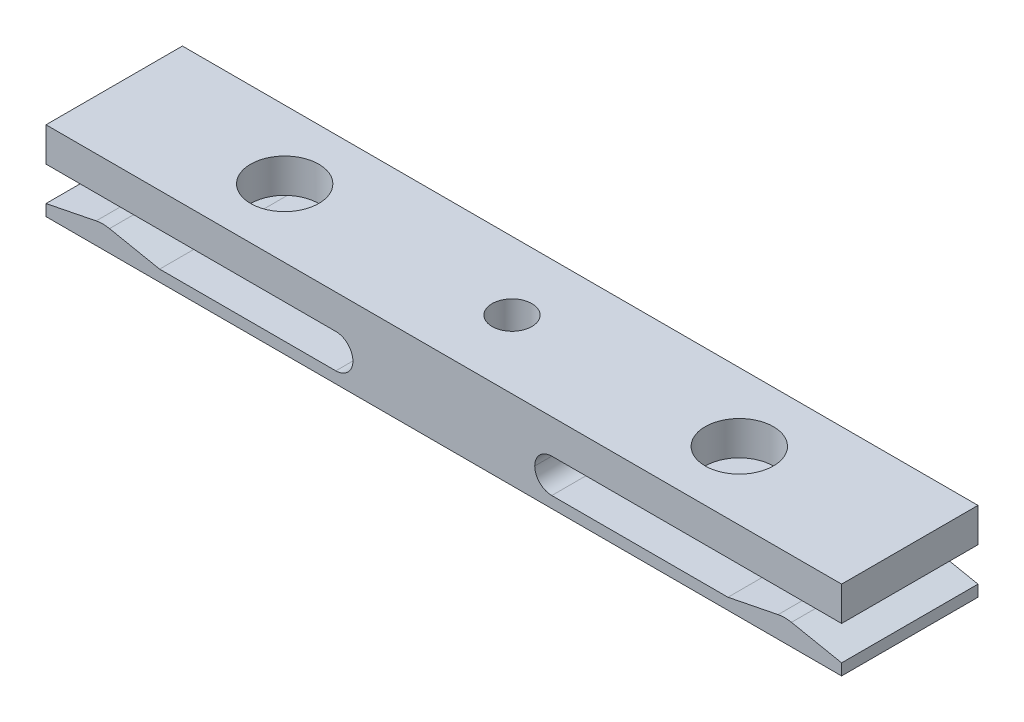
ISO-10303-21;
HEADER;
FILE_DESCRIPTION(('STEP AP214'),'2;1');
FILE_NAME('part.step','',(''),(''),'','','');
FILE_SCHEMA(('AUTOMOTIVE_DESIGN { 1 0 10303 214 1 1 1 1 }'));
ENDSEC;
DATA;
#1=APPLICATION_CONTEXT('core data for automotive mechanical design processes');
#2=APPLICATION_PROTOCOL_DEFINITION('international standard','automotive_design',2000,#1);
#3=PRODUCT_CONTEXT('',#1,'mechanical');
#4=PRODUCT('Part','Part','',(#3));
#5=PRODUCT_RELATED_PRODUCT_CATEGORY('part','',(#4));
#6=PRODUCT_DEFINITION_FORMATION('','',#4);
#7=PRODUCT_DEFINITION_CONTEXT('part definition',#1,'design');
#8=PRODUCT_DEFINITION('design','',#6,#7);
#9=PRODUCT_DEFINITION_SHAPE('','',#8);
#10=(LENGTH_UNIT() NAMED_UNIT(*) SI_UNIT(.MILLI.,.METRE.));
#11=(NAMED_UNIT(*) PLANE_ANGLE_UNIT() SI_UNIT($,.RADIAN.));
#12=(NAMED_UNIT(*) SI_UNIT($,.STERADIAN.) SOLID_ANGLE_UNIT());
#13=UNCERTAINTY_MEASURE_WITH_UNIT(LENGTH_MEASURE(1.E-05),#10,'distance_accuracy_value','');
#14=(GEOMETRIC_REPRESENTATION_CONTEXT(3) GLOBAL_UNCERTAINTY_ASSIGNED_CONTEXT((#13)) GLOBAL_UNIT_ASSIGNED_CONTEXT((#10,
#11,#12)) REPRESENTATION_CONTEXT('',''));
#15=CARTESIAN_POINT('',(0.,0.,0.));
#16=DIRECTION('',(0.,0.,1.));
#17=DIRECTION('',(1.,0.,0.));
#18=AXIS2_PLACEMENT_3D('',#15,#16,#17);
#19=CARTESIAN_POINT('',(0.,0.,6.));
#20=DIRECTION('',(0.,1.,0.));
#21=DIRECTION('',(-1.,0.,0.));
#22=AXIS2_PLACEMENT_3D('',#19,#20,#21);
#23=PLANE('',#22);
#24=CARTESIAN_POINT('',(20.,0.,0.));
#25=DIRECTION('',(0.,-1.,0.));
#26=DIRECTION('',(1.,0.,0.));
#27=AXIS2_PLACEMENT_3D('',#24,#25,#26);
#28=CIRCLE('',#27,4.);
#29=CARTESIAN_POINT('',(24.,0.,0.));
#30=VERTEX_POINT('',#29);
#31=EDGE_CURVE('E242',#30,#30,#28,.F.);
#32=ORIENTED_EDGE('',*,*,#31,.T.);
#33=EDGE_LOOP('',(#32));
#34=FACE_BOUND('',#33,.T.);
#35=CARTESIAN_POINT('',(-20.,0.,0.));
#36=DIRECTION('',(0.,1.,0.));
#37=DIRECTION('',(-1.,0.,0.));
#38=AXIS2_PLACEMENT_3D('',#35,#36,#37);
#39=CIRCLE('',#38,4.);
#40=CARTESIAN_POINT('',(-24.,0.,0.));
#41=VERTEX_POINT('',#40);
#42=EDGE_CURVE('E325',#41,#41,#39,.F.);
#43=ORIENTED_EDGE('',*,*,#42,.F.);
#44=EDGE_LOOP('',(#43));
#45=FACE_BOUND('',#44,.T.);
#46=DIRECTION('',(1.,0.,0.));
#47=VECTOR('',#46,1.);
#48=CARTESIAN_POINT('',(0.,0.,-6.));
#49=LINE('',#48,#47);
#50=CARTESIAN_POINT('',(-35.,0.,-6.));
#51=VERTEX_POINT('',#50);
#52=CARTESIAN_POINT('',(35.,0.,-6.));
#53=VERTEX_POINT('',#52);
#54=EDGE_CURVE('E295',#51,#53,#49,.T.);
#55=ORIENTED_EDGE('',*,*,#54,.T.);
#56=DIRECTION('',(0.,0.,-1.));
#57=VECTOR('',#56,1.);
#58=CARTESIAN_POINT('',(35.,0.,6.));
#59=LINE('',#58,#57);
#60=CARTESIAN_POINT('',(35.,0.,6.));
#61=VERTEX_POINT('',#60);
#62=EDGE_CURVE('E223',#61,#53,#59,.T.);
#63=ORIENTED_EDGE('',*,*,#62,.F.);
#64=DIRECTION('',(1.,0.,0.));
#65=VECTOR('',#64,1.);
#66=CARTESIAN_POINT('',(0.,0.,6.));
#67=LINE('',#66,#65);
#68=CARTESIAN_POINT('',(-35.,0.,6.));
#69=VERTEX_POINT('',#68);
#70=EDGE_CURVE('E296',#69,#61,#67,.T.);
#71=ORIENTED_EDGE('',*,*,#70,.F.);
#72=DIRECTION('',(0.,0.,-1.));
#73=VECTOR('',#72,1.);
#74=CARTESIAN_POINT('',(-35.,0.,6.));
#75=LINE('',#74,#73);
#76=EDGE_CURVE('E307',#69,#51,#75,.T.);
#77=ORIENTED_EDGE('',*,*,#76,.T.);
#78=EDGE_LOOP('',(#55,#63,#71,#77));
#79=FACE_BOUND('',#78,.T.);
#80=CARTESIAN_POINT('',(0.,0.,0.));
#81=DIRECTION('',(0.,1.,0.));
#82=DIRECTION('',(0.,0.,1.));
#83=AXIS2_PLACEMENT_3D('',#80,#81,#82);
#84=CIRCLE('',#83,1.75);
#85=CARTESIAN_POINT('',(0.,0.,1.75));
#86=VERTEX_POINT('',#85);
#87=EDGE_CURVE('E371',#86,#86,#84,.T.);
#88=ORIENTED_EDGE('',*,*,#87,.T.);
#89=EDGE_LOOP('',(#88));
#90=FACE_BOUND('',#89,.T.);
#91=ADVANCED_FACE('F33',(#34,#45,#79,#90),#23,.F.);
#92=CARTESIAN_POINT('',(0.,7.,6.));
#93=DIRECTION('',(0.,-1.,0.));
#94=DIRECTION('',(1.,0.,0.));
#95=AXIS2_PLACEMENT_3D('',#92,#93,#94);
#96=PLANE('',#95);
#97=CARTESIAN_POINT('',(-20.,7.,0.));
#98=DIRECTION('',(0.,1.,0.));
#99=DIRECTION('',(-1.,0.,0.));
#100=AXIS2_PLACEMENT_3D('',#97,#98,#99);
#101=CIRCLE('',#100,3.);
#102=CARTESIAN_POINT('',(-23.,7.,0.));
#103=VERTEX_POINT('',#102);
#104=EDGE_CURVE('E697',#103,#103,#101,.T.);
#105=ORIENTED_EDGE('',*,*,#104,.F.);
#106=EDGE_LOOP('',(#105));
#107=FACE_BOUND('',#106,.T.);
#108=CARTESIAN_POINT('',(20.,7.,0.));
#109=DIRECTION('',(0.,1.,0.));
#110=DIRECTION('',(-1.,0.,0.));
#111=AXIS2_PLACEMENT_3D('',#108,#109,#110);
#112=CIRCLE('',#111,3.);
#113=CARTESIAN_POINT('',(17.,7.,0.));
#114=VERTEX_POINT('',#113);
#115=EDGE_CURVE('E378',#114,#114,#112,.T.);
#116=ORIENTED_EDGE('',*,*,#115,.F.);
#117=EDGE_LOOP('',(#116));
#118=FACE_BOUND('',#117,.T.);
#119=DIRECTION('',(-1.,0.,0.));
#120=VECTOR('',#119,1.);
#121=CARTESIAN_POINT('',(0.,7.,-6.));
#122=LINE('',#121,#120);
#123=CARTESIAN_POINT('',(35.,7.,-6.));
#124=VERTEX_POINT('',#123);
#125=CARTESIAN_POINT('',(-35.,7.,-6.));
#126=VERTEX_POINT('',#125);
#127=EDGE_CURVE('E281',#124,#126,#122,.T.);
#128=ORIENTED_EDGE('',*,*,#127,.T.);
#129=DIRECTION('',(0.,0.,-1.));
#130=VECTOR('',#129,1.);
#131=CARTESIAN_POINT('',(-35.,7.,6.));
#132=LINE('',#131,#130);
#133=CARTESIAN_POINT('',(-35.,7.,6.));
#134=VERTEX_POINT('',#133);
#135=EDGE_CURVE('E178',#134,#126,#132,.T.);
#136=ORIENTED_EDGE('',*,*,#135,.F.);
#137=DIRECTION('',(-1.,0.,0.));
#138=VECTOR('',#137,1.);
#139=CARTESIAN_POINT('',(0.,7.,6.));
#140=LINE('',#139,#138);
#141=CARTESIAN_POINT('',(35.,7.,6.));
#142=VERTEX_POINT('',#141);
#143=EDGE_CURVE('E171',#142,#134,#140,.T.);
#144=ORIENTED_EDGE('',*,*,#143,.F.);
#145=DIRECTION('',(0.,0.,-1.));
#146=VECTOR('',#145,1.);
#147=CARTESIAN_POINT('',(35.,7.,6.));
#148=LINE('',#147,#146);
#149=EDGE_CURVE('E175',#142,#124,#148,.T.);
#150=ORIENTED_EDGE('',*,*,#149,.T.);
#151=EDGE_LOOP('',(#128,#136,#144,#150));
#152=FACE_BOUND('',#151,.T.);
#153=CARTESIAN_POINT('',(0.,7.,0.));
#154=DIRECTION('',(0.,1.,0.));
#155=DIRECTION('',(0.,0.,1.));
#156=AXIS2_PLACEMENT_3D('',#153,#154,#155);
#157=CIRCLE('',#156,1.75);
#158=CARTESIAN_POINT('',(0.,7.,1.75));
#159=VERTEX_POINT('',#158);
#160=EDGE_CURVE('E275',#159,#159,#157,.T.);
#161=ORIENTED_EDGE('',*,*,#160,.F.);
#162=EDGE_LOOP('',(#161));
#163=FACE_BOUND('',#162,.T.);
#164=ADVANCED_FACE('F173',(#107,#118,#152,#163),#96,.F.);
#165=CARTESIAN_POINT('',(-25.,0.999999999999997,6.));
#166=DIRECTION('',(0.,-1.,0.));
#167=DIRECTION('',(1.,0.,0.));
#168=AXIS2_PLACEMENT_3D('',#165,#166,#167);
#169=PLANE('',#168);
#170=CARTESIAN_POINT('',(-20.,0.999999999999997,0.));
#171=DIRECTION('',(0.,-1.,0.));
#172=DIRECTION('',(1.,0.,0.));
#173=AXIS2_PLACEMENT_3D('',#170,#171,#172);
#174=CIRCLE('',#173,2.);
#175=CARTESIAN_POINT('',(-18.,0.999999999999997,0.));
#176=VERTEX_POINT('',#175);
#177=EDGE_CURVE('E279',#176,#176,#174,.T.);
#178=ORIENTED_EDGE('',*,*,#177,.T.);
#179=EDGE_LOOP('',(#178));
#180=FACE_BOUND('',#179,.T.);
#181=DIRECTION('',(-1.,0.,0.));
#182=VECTOR('',#181,1.);
#183=CARTESIAN_POINT('',(-25.,0.999999999999997,6.));
#184=LINE('',#183,#182);
#185=CARTESIAN_POINT('',(-9.5,0.999999999999996,6.));
#186=VERTEX_POINT('',#185);
#187=CARTESIAN_POINT('',(-25.,0.999999999999997,6.));
#188=VERTEX_POINT('',#187);
#189=EDGE_CURVE('E298',#186,#188,#184,.T.);
#190=ORIENTED_EDGE('',*,*,#189,.F.);
#191=DIRECTION('',(0.,0.,-1.));
#192=VECTOR('',#191,1.);
#193=CARTESIAN_POINT('',(-9.5,0.999999999999996,-6.));
#194=LINE('',#193,#192);
#195=CARTESIAN_POINT('',(-9.5,0.999999999999996,-6.));
#196=VERTEX_POINT('',#195);
#197=EDGE_CURVE('E340',#186,#196,#194,.T.);
#198=ORIENTED_EDGE('',*,*,#197,.T.);
#199=DIRECTION('',(-1.,0.,0.));
#200=VECTOR('',#199,1.);
#201=CARTESIAN_POINT('',(-25.,0.999999999999997,-6.));
#202=LINE('',#201,#200);
#203=CARTESIAN_POINT('',(-25.,0.999999999999997,-6.));
#204=VERTEX_POINT('',#203);
#205=EDGE_CURVE('E309',#196,#204,#202,.T.);
#206=ORIENTED_EDGE('',*,*,#205,.T.);
#207=DIRECTION('',(0.,0.,-1.));
#208=VECTOR('',#207,1.);
#209=CARTESIAN_POINT('',(-25.,0.999999999999997,6.));
#210=LINE('',#209,#208);
#211=EDGE_CURVE('E322',#188,#204,#210,.T.);
#212=ORIENTED_EDGE('',*,*,#211,.F.);
#213=EDGE_LOOP('',(#190,#198,#206,#212));
#214=FACE_BOUND('',#213,.T.);
#215=ADVANCED_FACE('F428',(#180,#214),#169,.F.);
#216=CARTESIAN_POINT('',(-30.,2.,6.));
#217=DIRECTION('',(-0.196116135138184,-0.98058067569092,0.));
#218=DIRECTION('',(0.98058067569092,-0.196116135138184,0.));
#219=AXIS2_PLACEMENT_3D('',#216,#217,#218);
#220=PLANE('',#219);
#221=DIRECTION('',(-0.98058067569092,0.196116135138184,0.));
#222=VECTOR('',#221,1.);
#223=CARTESIAN_POINT('',(-30.,2.,-6.));
#224=LINE('',#223,#222);
#225=CARTESIAN_POINT('',(-29.4116515945854,1.88233031891709,-6.));
#226=VERTEX_POINT('',#225);
#227=EDGE_CURVE('E311',#204,#226,#224,.T.);
#228=ORIENTED_EDGE('',*,*,#227,.T.);
#229=DIRECTION('',(0.,0.,-1.));
#230=VECTOR('',#229,1.);
#231=CARTESIAN_POINT('',(-29.4116515945854,1.88233031891709,6.));
#232=LINE('',#231,#230);
#233=CARTESIAN_POINT('',(-29.4116515945854,1.88233031891709,6.));
#234=VERTEX_POINT('',#233);
#235=EDGE_CURVE('E333',#226,#234,#232,.F.);
#236=ORIENTED_EDGE('',*,*,#235,.T.);
#237=DIRECTION('',(-0.98058067569092,0.196116135138184,0.));
#238=VECTOR('',#237,1.);
#239=CARTESIAN_POINT('',(-30.,2.,6.));
#240=LINE('',#239,#238);
#241=EDGE_CURVE('E301',#188,#234,#240,.T.);
#242=ORIENTED_EDGE('',*,*,#241,.F.);
#243=ORIENTED_EDGE('',*,*,#211,.T.);
#244=EDGE_LOOP('',(#228,#236,#242,#243));
#245=FACE_BOUND('',#244,.T.);
#246=ADVANCED_FACE('F432',(#245),#220,.F.);
#247=CARTESIAN_POINT('',(-35.,0.999999999999996,6.));
#248=DIRECTION('',(0.196116135138184,-0.98058067569092,0.));
#249=DIRECTION('',(0.98058067569092,0.196116135138184,0.));
#250=AXIS2_PLACEMENT_3D('',#247,#248,#249);
#251=PLANE('',#250);
#252=DIRECTION('',(-0.98058067569092,-0.196116135138184,0.));
#253=VECTOR('',#252,1.);
#254=CARTESIAN_POINT('',(-35.,0.999999999999996,6.));
#255=LINE('',#254,#253);
#256=CARTESIAN_POINT('',(-30.5883484054145,1.88233031891709,6.));
#257=VERTEX_POINT('',#256);
#258=CARTESIAN_POINT('',(-35.,0.999999999999996,6.));
#259=VERTEX_POINT('',#258);
#260=EDGE_CURVE('E303',#257,#259,#255,.T.);
#261=ORIENTED_EDGE('',*,*,#260,.F.);
#262=DIRECTION('',(0.,0.,-1.));
#263=VECTOR('',#262,1.);
#264=CARTESIAN_POINT('',(-30.5883484054145,1.88233031891709,6.));
#265=LINE('',#264,#263);
#266=CARTESIAN_POINT('',(-30.5883484054145,1.88233031891709,-6.));
#267=VERTEX_POINT('',#266);
#268=EDGE_CURVE('E328',#257,#267,#265,.T.);
#269=ORIENTED_EDGE('',*,*,#268,.T.);
#270=DIRECTION('',(-0.98058067569092,-0.196116135138184,0.));
#271=VECTOR('',#270,1.);
#272=CARTESIAN_POINT('',(-35.,0.999999999999996,-6.));
#273=LINE('',#272,#271);
#274=CARTESIAN_POINT('',(-35.,0.999999999999996,-6.));
#275=VERTEX_POINT('',#274);
#276=EDGE_CURVE('E314',#267,#275,#273,.T.);
#277=ORIENTED_EDGE('',*,*,#276,.T.);
#278=DIRECTION('',(0.,0.,-1.));
#279=VECTOR('',#278,1.);
#280=CARTESIAN_POINT('',(-35.,0.999999999999996,6.));
#281=LINE('',#280,#279);
#282=EDGE_CURVE('E319',#259,#275,#281,.T.);
#283=ORIENTED_EDGE('',*,*,#282,.F.);
#284=EDGE_LOOP('',(#261,#269,#277,#283));
#285=FACE_BOUND('',#284,.T.);
#286=ADVANCED_FACE('F440',(#285),#251,.F.);
#287=CARTESIAN_POINT('',(-35.,0.,6.));
#288=DIRECTION('',(1.,0.,0.));
#289=DIRECTION('',(0.,0.,-1.));
#290=AXIS2_PLACEMENT_3D('',#287,#288,#289);
#291=PLANE('',#290);
#292=DIRECTION('',(0.,-1.,0.));
#293=VECTOR('',#292,1.);
#294=CARTESIAN_POINT('',(-35.,0.,-6.));
#295=LINE('',#294,#293);
#296=EDGE_CURVE('E299',#275,#51,#295,.T.);
#297=ORIENTED_EDGE('',*,*,#296,.T.);
#298=ORIENTED_EDGE('',*,*,#76,.F.);
#299=DIRECTION('',(0.,-1.,0.));
#300=VECTOR('',#299,1.);
#301=CARTESIAN_POINT('',(-35.,0.,6.));
#302=LINE('',#301,#300);
#303=EDGE_CURVE('E305',#259,#69,#302,.T.);
#304=ORIENTED_EDGE('',*,*,#303,.F.);
#305=ORIENTED_EDGE('',*,*,#282,.T.);
#306=EDGE_LOOP('',(#297,#298,#304,#305));
#307=FACE_BOUND('',#306,.T.);
#308=ADVANCED_FACE('F445',(#307),#291,.F.);
#309=CARTESIAN_POINT('',(0.,0.,6.));
#310=DIRECTION('',(0.,0.,-1.));
#311=DIRECTION('',(-1.,0.,0.));
#312=AXIS2_PLACEMENT_3D('',#309,#310,#311);
#313=PLANE('',#312);
#314=ORIENTED_EDGE('',*,*,#241,.T.);
#315=CARTESIAN_POINT('',(-30.,-1.05941170815567,6.));
#316=DIRECTION('',(0.,0.,-1.));
#317=DIRECTION('',(-1.,0.,0.));
#318=AXIS2_PLACEMENT_3D('',#315,#316,#317);
#319=CIRCLE('',#318,3.);
#320=EDGE_CURVE('E335',#234,#257,#319,.F.);
#321=ORIENTED_EDGE('',*,*,#320,.T.);
#322=ORIENTED_EDGE('',*,*,#260,.T.);
#323=ORIENTED_EDGE('',*,*,#303,.T.);
#324=ORIENTED_EDGE('',*,*,#70,.T.);
#325=DIRECTION('',(0.,-1.,0.));
#326=VECTOR('',#325,1.);
#327=CARTESIAN_POINT('',(35.,0.,6.));
#328=LINE('',#327,#326);
#329=CARTESIAN_POINT('',(35.,0.999999999999996,6.));
#330=VERTEX_POINT('',#329);
#331=EDGE_CURVE('E220',#330,#61,#328,.T.);
#332=ORIENTED_EDGE('',*,*,#331,.F.);
#333=DIRECTION('',(0.98058067569092,-0.196116135138184,0.));
#334=VECTOR('',#333,1.);
#335=CARTESIAN_POINT('',(35.,0.999999999999996,6.));
#336=LINE('',#335,#334);
#337=CARTESIAN_POINT('',(30.5883484054145,1.88233031891709,6.));
#338=VERTEX_POINT('',#337);
#339=EDGE_CURVE('E217',#338,#330,#336,.T.);
#340=ORIENTED_EDGE('',*,*,#339,.F.);
#341=CARTESIAN_POINT('',(30.,-1.05941170815567,6.));
#342=DIRECTION('',(0.,0.,1.));
#343=DIRECTION('',(1.,0.,0.));
#344=AXIS2_PLACEMENT_3D('',#341,#342,#343);
#345=CIRCLE('',#344,3.);
#346=CARTESIAN_POINT('',(29.4116515945854,1.88233031891709,6.));
#347=VERTEX_POINT('',#346);
#348=EDGE_CURVE('E253',#347,#338,#345,.F.);
#349=ORIENTED_EDGE('',*,*,#348,.F.);
#350=DIRECTION('',(0.98058067569092,0.196116135138184,0.));
#351=VECTOR('',#350,1.);
#352=CARTESIAN_POINT('',(30.,2.,6.));
#353=LINE('',#352,#351);
#354=CARTESIAN_POINT('',(25.,0.999999999999997,6.));
#355=VERTEX_POINT('',#354);
#356=EDGE_CURVE('E213',#355,#347,#353,.T.);
#357=ORIENTED_EDGE('',*,*,#356,.F.);
#358=DIRECTION('',(1.,0.,0.));
#359=VECTOR('',#358,1.);
#360=CARTESIAN_POINT('',(25.,0.999999999999997,6.));
#361=LINE('',#360,#359);
#362=CARTESIAN_POINT('',(9.5,0.999999999999996,6.));
#363=VERTEX_POINT('',#362);
#364=EDGE_CURVE('E210',#363,#355,#361,.T.);
#365=ORIENTED_EDGE('',*,*,#364,.F.);
#366=CARTESIAN_POINT('',(9.5,2.5,6.));
#367=DIRECTION('',(0.,0.,1.));
#368=DIRECTION('',(1.,0.,0.));
#369=AXIS2_PLACEMENT_3D('',#366,#367,#368);
#370=CIRCLE('',#369,1.5);
#371=CARTESIAN_POINT('',(8.,2.5,6.));
#372=VERTEX_POINT('',#371);
#373=EDGE_CURVE('E269',#372,#363,#370,.T.);
#374=ORIENTED_EDGE('',*,*,#373,.F.);
#375=CARTESIAN_POINT('',(9.5,2.5,6.));
#376=DIRECTION('',(0.,0.,1.));
#377=DIRECTION('',(1.,0.,0.));
#378=AXIS2_PLACEMENT_3D('',#375,#376,#377);
#379=CIRCLE('',#378,1.5);
#380=CARTESIAN_POINT('',(9.5,4.,6.));
#381=VERTEX_POINT('',#380);
#382=EDGE_CURVE('E263',#381,#372,#379,.T.);
#383=ORIENTED_EDGE('',*,*,#382,.F.);
#384=DIRECTION('',(-1.,0.,0.));
#385=VECTOR('',#384,1.);
#386=CARTESIAN_POINT('',(35.,4.,6.));
#387=LINE('',#386,#385);
#388=CARTESIAN_POINT('',(35.,4.,6.));
#389=VERTEX_POINT('',#388);
#390=EDGE_CURVE('E198',#389,#381,#387,.T.);
#391=ORIENTED_EDGE('',*,*,#390,.F.);
#392=DIRECTION('',(0.,-1.,0.));
#393=VECTOR('',#392,1.);
#394=CARTESIAN_POINT('',(35.,7.,6.));
#395=LINE('',#394,#393);
#396=EDGE_CURVE('E187',#142,#389,#395,.T.);
#397=ORIENTED_EDGE('',*,*,#396,.F.);
#398=ORIENTED_EDGE('',*,*,#143,.T.);
#399=DIRECTION('',(0.,-1.,0.));
#400=VECTOR('',#399,1.);
#401=CARTESIAN_POINT('',(-35.,7.,6.));
#402=LINE('',#401,#400);
#403=CARTESIAN_POINT('',(-35.,4.,6.));
#404=VERTEX_POINT('',#403);
#405=EDGE_CURVE('E181',#134,#404,#402,.T.);
#406=ORIENTED_EDGE('',*,*,#405,.T.);
#407=DIRECTION('',(1.,0.,0.));
#408=VECTOR('',#407,1.);
#409=CARTESIAN_POINT('',(-35.,4.,6.));
#410=LINE('',#409,#408);
#411=CARTESIAN_POINT('',(-9.5,4.,6.));
#412=VERTEX_POINT('',#411);
#413=EDGE_CURVE('E284',#404,#412,#410,.T.);
#414=ORIENTED_EDGE('',*,*,#413,.T.);
#415=CARTESIAN_POINT('',(-9.5,2.5,6.));
#416=DIRECTION('',(0.,0.,-1.));
#417=DIRECTION('',(-1.,0.,0.));
#418=AXIS2_PLACEMENT_3D('',#415,#416,#417);
#419=CIRCLE('',#418,1.5);
#420=CARTESIAN_POINT('',(-8.,2.5,6.));
#421=VERTEX_POINT('',#420);
#422=EDGE_CURVE('E48',#412,#421,#419,.T.);
#423=ORIENTED_EDGE('',*,*,#422,.T.);
#424=CARTESIAN_POINT('',(-9.5,2.5,6.));
#425=DIRECTION('',(0.,0.,-1.));
#426=DIRECTION('',(-1.,0.,0.));
#427=AXIS2_PLACEMENT_3D('',#424,#425,#426);
#428=CIRCLE('',#427,1.5);
#429=EDGE_CURVE('E346',#421,#186,#428,.T.);
#430=ORIENTED_EDGE('',*,*,#429,.T.);
#431=ORIENTED_EDGE('',*,*,#189,.T.);
#432=EDGE_LOOP('',(#314,#321,#322,#323,#324,#332,#340,#349,#357,#365,#374,#383,#391,#397,#398,
#406,#414,#423,#430,#431));
#433=FACE_BOUND('',#432,.T.);
#434=ADVANCED_FACE('F195',(#433),#313,.F.);
#435=CARTESIAN_POINT('',(0.,0.,-6.));
#436=DIRECTION('',(0.,0.,-1.));
#437=DIRECTION('',(-1.,0.,0.));
#438=AXIS2_PLACEMENT_3D('',#435,#436,#437);
#439=PLANE('',#438);
#440=ORIENTED_EDGE('',*,*,#276,.F.);
#441=CARTESIAN_POINT('',(-30.,-1.05941170815567,-6.));
#442=DIRECTION('',(0.,0.,-1.));
#443=DIRECTION('',(-1.,0.,0.));
#444=AXIS2_PLACEMENT_3D('',#441,#442,#443);
#445=CIRCLE('',#444,3.);
#446=EDGE_CURVE('E331',#267,#226,#445,.T.);
#447=ORIENTED_EDGE('',*,*,#446,.T.);
#448=ORIENTED_EDGE('',*,*,#227,.F.);
#449=ORIENTED_EDGE('',*,*,#205,.F.);
#450=CARTESIAN_POINT('',(-9.5,2.5,-6.));
#451=DIRECTION('',(0.,0.,-1.));
#452=DIRECTION('',(-1.,0.,0.));
#453=AXIS2_PLACEMENT_3D('',#450,#451,#452);
#454=CIRCLE('',#453,1.5);
#455=CARTESIAN_POINT('',(-8.,2.5,-6.));
#456=VERTEX_POINT('',#455);
#457=EDGE_CURVE('E56',#196,#456,#454,.F.);
#458=ORIENTED_EDGE('',*,*,#457,.T.);
#459=CARTESIAN_POINT('',(-9.5,2.5,-6.));
#460=DIRECTION('',(0.,0.,-1.));
#461=DIRECTION('',(-1.,0.,0.));
#462=AXIS2_PLACEMENT_3D('',#459,#460,#461);
#463=CIRCLE('',#462,1.5);
#464=CARTESIAN_POINT('',(-9.5,4.,-6.));
#465=VERTEX_POINT('',#464);
#466=EDGE_CURVE('E342',#456,#465,#463,.F.);
#467=ORIENTED_EDGE('',*,*,#466,.T.);
#468=DIRECTION('',(1.,0.,0.));
#469=VECTOR('',#468,1.);
#470=CARTESIAN_POINT('',(-35.,4.,-6.));
#471=LINE('',#470,#469);
#472=CARTESIAN_POINT('',(-35.,4.,-6.));
#473=VERTEX_POINT('',#472);
#474=EDGE_CURVE('E182',#473,#465,#471,.T.);
#475=ORIENTED_EDGE('',*,*,#474,.F.);
#476=DIRECTION('',(0.,-1.,0.));
#477=VECTOR('',#476,1.);
#478=CARTESIAN_POINT('',(-35.,7.,-6.));
#479=LINE('',#478,#477);
#480=EDGE_CURVE('E288',#126,#473,#479,.T.);
#481=ORIENTED_EDGE('',*,*,#480,.F.);
#482=ORIENTED_EDGE('',*,*,#127,.F.);
#483=DIRECTION('',(0.,-1.,0.));
#484=VECTOR('',#483,1.);
#485=CARTESIAN_POINT('',(35.,7.,-6.));
#486=LINE('',#485,#484);
#487=CARTESIAN_POINT('',(35.,4.,-6.));
#488=VERTEX_POINT('',#487);
#489=EDGE_CURVE('E190',#124,#488,#486,.T.);
#490=ORIENTED_EDGE('',*,*,#489,.T.);
#491=DIRECTION('',(-1.,0.,0.));
#492=VECTOR('',#491,1.);
#493=CARTESIAN_POINT('',(35.,4.,-6.));
#494=LINE('',#493,#492);
#495=CARTESIAN_POINT('',(9.5,4.,-6.));
#496=VERTEX_POINT('',#495);
#497=EDGE_CURVE('E199',#488,#496,#494,.T.);
#498=ORIENTED_EDGE('',*,*,#497,.T.);
#499=CARTESIAN_POINT('',(9.5,2.5,-6.));
#500=DIRECTION('',(0.,0.,1.));
#501=DIRECTION('',(1.,0.,0.));
#502=AXIS2_PLACEMENT_3D('',#499,#500,#501);
#503=CIRCLE('',#502,1.5);
#504=CARTESIAN_POINT('',(8.,2.5,-6.));
#505=VERTEX_POINT('',#504);
#506=EDGE_CURVE('E260',#505,#496,#503,.F.);
#507=ORIENTED_EDGE('',*,*,#506,.F.);
#508=CARTESIAN_POINT('',(9.5,2.5,-6.));
#509=DIRECTION('',(0.,0.,1.));
#510=DIRECTION('',(1.,0.,0.));
#511=AXIS2_PLACEMENT_3D('',#508,#509,#510);
#512=CIRCLE('',#511,1.5);
#513=CARTESIAN_POINT('',(9.5,0.999999999999996,-6.));
#514=VERTEX_POINT('',#513);
#515=EDGE_CURVE('E266',#514,#505,#512,.F.);
#516=ORIENTED_EDGE('',*,*,#515,.F.);
#517=DIRECTION('',(1.,0.,0.));
#518=VECTOR('',#517,1.);
#519=CARTESIAN_POINT('',(25.,0.999999999999997,-6.));
#520=LINE('',#519,#518);
#521=CARTESIAN_POINT('',(25.,0.999999999999997,-6.));
#522=VERTEX_POINT('',#521);
#523=EDGE_CURVE('E191',#514,#522,#520,.T.);
#524=ORIENTED_EDGE('',*,*,#523,.T.);
#525=DIRECTION('',(0.98058067569092,0.196116135138184,0.));
#526=VECTOR('',#525,1.);
#527=CARTESIAN_POINT('',(30.,2.,-6.));
#528=LINE('',#527,#526);
#529=CARTESIAN_POINT('',(29.4116515945854,1.88233031891709,-6.));
#530=VERTEX_POINT('',#529);
#531=EDGE_CURVE('E226',#522,#530,#528,.T.);
#532=ORIENTED_EDGE('',*,*,#531,.T.);
#533=CARTESIAN_POINT('',(30.,-1.05941170815567,-6.));
#534=DIRECTION('',(0.,0.,1.));
#535=DIRECTION('',(1.,0.,0.));
#536=AXIS2_PLACEMENT_3D('',#533,#534,#535);
#537=CIRCLE('',#536,3.);
#538=CARTESIAN_POINT('',(30.5883484054145,1.88233031891709,-6.));
#539=VERTEX_POINT('',#538);
#540=EDGE_CURVE('E248',#539,#530,#537,.T.);
#541=ORIENTED_EDGE('',*,*,#540,.F.);
#542=DIRECTION('',(0.98058067569092,-0.196116135138184,0.));
#543=VECTOR('',#542,1.);
#544=CARTESIAN_POINT('',(35.,0.999999999999996,-6.));
#545=LINE('',#544,#543);
#546=CARTESIAN_POINT('',(35.,0.999999999999996,-6.));
#547=VERTEX_POINT('',#546);
#548=EDGE_CURVE('E229',#539,#547,#545,.T.);
#549=ORIENTED_EDGE('',*,*,#548,.T.);
#550=DIRECTION('',(0.,-1.,0.));
#551=VECTOR('',#550,1.);
#552=CARTESIAN_POINT('',(35.,0.,-6.));
#553=LINE('',#552,#551);
#554=EDGE_CURVE('E214',#547,#53,#553,.T.);
#555=ORIENTED_EDGE('',*,*,#554,.T.);
#556=ORIENTED_EDGE('',*,*,#54,.F.);
#557=ORIENTED_EDGE('',*,*,#296,.F.);
#558=EDGE_LOOP('',(#440,#447,#448,#449,#458,#467,#475,#481,#482,#490,#498,#507,#516,#524,#532,
#541,#549,#555,#556,#557));
#559=FACE_BOUND('',#558,.T.);
#560=ADVANCED_FACE('F402',(#559),#439,.T.);
#561=CARTESIAN_POINT('',(-20.,-1.,0.));
#562=DIRECTION('',(0.,-1.,0.));
#563=DIRECTION('',(1.,0.,0.));
#564=AXIS2_PLACEMENT_3D('',#561,#562,#563);
#565=PLANE('',#564);
#566=CARTESIAN_POINT('',(-20.,-1.,0.));
#567=DIRECTION('',(0.,-1.,0.));
#568=DIRECTION('',(1.,0.,0.));
#569=AXIS2_PLACEMENT_3D('',#566,#567,#568);
#570=CIRCLE('',#569,3.);
#571=CARTESIAN_POINT('',(-17.,-1.,0.));
#572=VERTEX_POINT('',#571);
#573=EDGE_CURVE('E11',#572,#572,#570,.T.);
#574=ORIENTED_EDGE('',*,*,#573,.T.);
#575=EDGE_LOOP('',(#574));
#576=FACE_BOUND('',#575,.T.);
#577=CARTESIAN_POINT('',(-20.,-1.,0.));
#578=DIRECTION('',(0.,-1.,0.));
#579=DIRECTION('',(1.,0.,0.));
#580=AXIS2_PLACEMENT_3D('',#577,#578,#579);
#581=CIRCLE('',#580,2.);
#582=CARTESIAN_POINT('',(-18.,-1.,0.));
#583=VERTEX_POINT('',#582);
#584=EDGE_CURVE('E276',#583,#583,#581,.T.);
#585=ORIENTED_EDGE('',*,*,#584,.F.);
#586=EDGE_LOOP('',(#585));
#587=FACE_BOUND('',#586,.T.);
#588=ADVANCED_FACE('F480',(#576,#587),#565,.T.);
#589=CARTESIAN_POINT('',(-35.,7.,6.));
#590=DIRECTION('',(1.,0.,0.));
#591=DIRECTION('',(0.,0.,-1.));
#592=AXIS2_PLACEMENT_3D('',#589,#590,#591);
#593=PLANE('',#592);
#594=ORIENTED_EDGE('',*,*,#480,.T.);
#595=DIRECTION('',(0.,0.,-1.));
#596=VECTOR('',#595,1.);
#597=CARTESIAN_POINT('',(-35.,4.,6.));
#598=LINE('',#597,#596);
#599=EDGE_CURVE('E286',#404,#473,#598,.T.);
#600=ORIENTED_EDGE('',*,*,#599,.F.);
#601=ORIENTED_EDGE('',*,*,#405,.F.);
#602=ORIENTED_EDGE('',*,*,#135,.T.);
#603=EDGE_LOOP('',(#594,#600,#601,#602));
#604=FACE_BOUND('',#603,.T.);
#605=ADVANCED_FACE('F414',(#604),#593,.F.);
#606=CARTESIAN_POINT('',(-35.,4.,6.));
#607=DIRECTION('',(0.,1.,0.));
#608=DIRECTION('',(0.,0.,1.));
#609=AXIS2_PLACEMENT_3D('',#606,#607,#608);
#610=PLANE('',#609);
#611=CARTESIAN_POINT('',(-20.,4.,0.));
#612=DIRECTION('',(0.,1.,0.));
#613=DIRECTION('',(0.,0.,1.));
#614=AXIS2_PLACEMENT_3D('',#611,#612,#613);
#615=CIRCLE('',#614,3.);
#616=CARTESIAN_POINT('',(-20.,4.,3.));
#617=VERTEX_POINT('',#616);
#618=EDGE_CURVE('E694',#617,#617,#615,.F.);
#619=ORIENTED_EDGE('',*,*,#618,.F.);
#620=EDGE_LOOP('',(#619));
#621=FACE_BOUND('',#620,.T.);
#622=ORIENTED_EDGE('',*,*,#474,.T.);
#623=DIRECTION('',(0.,0.,-1.));
#624=VECTOR('',#623,1.);
#625=CARTESIAN_POINT('',(-9.5,4.,6.));
#626=LINE('',#625,#624);
#627=EDGE_CURVE('E337',#465,#412,#626,.F.);
#628=ORIENTED_EDGE('',*,*,#627,.T.);
#629=ORIENTED_EDGE('',*,*,#413,.F.);
#630=ORIENTED_EDGE('',*,*,#599,.T.);
#631=EDGE_LOOP('',(#622,#628,#629,#630));
#632=FACE_BOUND('',#631,.T.);
#633=ADVANCED_FACE('F418',(#621,#632),#610,.F.);
#634=CARTESIAN_POINT('',(-20.,7.,0.));
#635=DIRECTION('',(0.,-1.,0.));
#636=DIRECTION('',(1.,0.,0.));
#637=AXIS2_PLACEMENT_3D('',#634,#635,#636);
#638=CYLINDRICAL_SURFACE('',#637,2.);
#639=ORIENTED_EDGE('',*,*,#584,.T.);
#640=EDGE_LOOP('',(#639));
#641=FACE_BOUND('',#640,.T.);
#642=ORIENTED_EDGE('',*,*,#177,.F.);
#643=EDGE_LOOP('',(#642));
#644=FACE_BOUND('',#643,.T.);
#645=ADVANCED_FACE('F471',(#641,#644),#638,.F.);
#646=CARTESIAN_POINT('',(-30.,-1.05941170815567,6.));
#647=DIRECTION('',(0.,0.,-1.));
#648=DIRECTION('',(-1.,0.,0.));
#649=AXIS2_PLACEMENT_3D('',#646,#647,#648);
#650=CYLINDRICAL_SURFACE('',#649,3.);
#651=ORIENTED_EDGE('',*,*,#320,.F.);
#652=ORIENTED_EDGE('',*,*,#235,.F.);
#653=ORIENTED_EDGE('',*,*,#446,.F.);
#654=ORIENTED_EDGE('',*,*,#268,.F.);
#655=EDGE_LOOP('',(#651,#652,#653,#654));
#656=FACE_BOUND('',#655,.T.);
#657=ADVANCED_FACE('F438',(#656),#650,.T.);
#658=CARTESIAN_POINT('',(-9.5,2.5,6.));
#659=DIRECTION('',(0.,0.,1.));
#660=DIRECTION('',(1.,0.,0.));
#661=AXIS2_PLACEMENT_3D('',#658,#659,#660);
#662=CYLINDRICAL_SURFACE('',#661,1.5);
#663=ORIENTED_EDGE('',*,*,#197,.F.);
#664=ORIENTED_EDGE('',*,*,#429,.F.);
#665=DIRECTION('',(0.,0.,-1.));
#666=VECTOR('',#665,1.);
#667=CARTESIAN_POINT('',(-8.,2.5,6.));
#668=LINE('',#667,#666);
#669=EDGE_CURVE('E271',#456,#421,#668,.F.);
#670=ORIENTED_EDGE('',*,*,#669,.F.);
#671=ORIENTED_EDGE('',*,*,#457,.F.);
#672=EDGE_LOOP('',(#663,#664,#670,#671));
#673=FACE_BOUND('',#672,.T.);
#674=ADVANCED_FACE('F424',(#673),#662,.F.);
#675=CARTESIAN_POINT('',(-9.5,2.5,6.));
#676=DIRECTION('',(0.,0.,1.));
#677=DIRECTION('',(1.,0.,0.));
#678=AXIS2_PLACEMENT_3D('',#675,#676,#677);
#679=CYLINDRICAL_SURFACE('',#678,1.5);
#680=ORIENTED_EDGE('',*,*,#422,.F.);
#681=ORIENTED_EDGE('',*,*,#627,.F.);
#682=ORIENTED_EDGE('',*,*,#466,.F.);
#683=ORIENTED_EDGE('',*,*,#669,.T.);
#684=EDGE_LOOP('',(#680,#681,#682,#683));
#685=FACE_BOUND('',#684,.T.);
#686=ADVANCED_FACE('F391',(#685),#679,.F.);
#687=CARTESIAN_POINT('',(25.,0.999999999999997,6.));
#688=DIRECTION('',(0.,-1.,0.));
#689=DIRECTION('',(-1.,0.,0.));
#690=AXIS2_PLACEMENT_3D('',#687,#688,#689);
#691=PLANE('',#690);
#692=CARTESIAN_POINT('',(20.,0.999999999999997,0.));
#693=DIRECTION('',(0.,1.,0.));
#694=DIRECTION('',(-1.,0.,0.));
#695=AXIS2_PLACEMENT_3D('',#692,#693,#694);
#696=CIRCLE('',#695,2.);
#697=CARTESIAN_POINT('',(18.,0.999999999999997,0.));
#698=VERTEX_POINT('',#697);
#699=EDGE_CURVE('E205',#698,#698,#696,.T.);
#700=ORIENTED_EDGE('',*,*,#699,.F.);
#701=EDGE_LOOP('',(#700));
#702=FACE_BOUND('',#701,.T.);
#703=ORIENTED_EDGE('',*,*,#364,.T.);
#704=DIRECTION('',(0.,0.,-1.));
#705=VECTOR('',#704,1.);
#706=CARTESIAN_POINT('',(25.,0.999999999999997,6.));
#707=LINE('',#706,#705);
#708=EDGE_CURVE('E239',#355,#522,#707,.T.);
#709=ORIENTED_EDGE('',*,*,#708,.T.);
#710=ORIENTED_EDGE('',*,*,#523,.F.);
#711=DIRECTION('',(0.,0.,-1.));
#712=VECTOR('',#711,1.);
#713=CARTESIAN_POINT('',(9.5,0.999999999999996,-6.));
#714=LINE('',#713,#712);
#715=EDGE_CURVE('E257',#363,#514,#714,.T.);
#716=ORIENTED_EDGE('',*,*,#715,.F.);
#717=EDGE_LOOP('',(#703,#709,#710,#716));
#718=FACE_BOUND('',#717,.T.);
#719=ADVANCED_FACE('F387',(#702,#718),#691,.F.);
#720=CARTESIAN_POINT('',(30.,2.,6.));
#721=DIRECTION('',(0.196116135138184,-0.98058067569092,0.));
#722=DIRECTION('',(-0.98058067569092,-0.196116135138184,0.));
#723=AXIS2_PLACEMENT_3D('',#720,#721,#722);
#724=PLANE('',#723);
#725=ORIENTED_EDGE('',*,*,#531,.F.);
#726=ORIENTED_EDGE('',*,*,#708,.F.);
#727=ORIENTED_EDGE('',*,*,#356,.T.);
#728=DIRECTION('',(0.,0.,-1.));
#729=VECTOR('',#728,1.);
#730=CARTESIAN_POINT('',(29.4116515945854,1.88233031891709,6.));
#731=LINE('',#730,#729);
#732=EDGE_CURVE('E250',#530,#347,#731,.F.);
#733=ORIENTED_EDGE('',*,*,#732,.F.);
#734=EDGE_LOOP('',(#725,#726,#727,#733));
#735=FACE_BOUND('',#734,.T.);
#736=ADVANCED_FACE('F390',(#735),#724,.F.);
#737=CARTESIAN_POINT('',(35.,0.999999999999996,6.));
#738=DIRECTION('',(-0.196116135138184,-0.98058067569092,0.));
#739=DIRECTION('',(-0.98058067569092,0.196116135138184,0.));
#740=AXIS2_PLACEMENT_3D('',#737,#738,#739);
#741=PLANE('',#740);
#742=ORIENTED_EDGE('',*,*,#339,.T.);
#743=DIRECTION('',(0.,0.,-1.));
#744=VECTOR('',#743,1.);
#745=CARTESIAN_POINT('',(35.,0.999999999999996,6.));
#746=LINE('',#745,#744);
#747=EDGE_CURVE('E236',#330,#547,#746,.T.);
#748=ORIENTED_EDGE('',*,*,#747,.T.);
#749=ORIENTED_EDGE('',*,*,#548,.F.);
#750=DIRECTION('',(0.,0.,-1.));
#751=VECTOR('',#750,1.);
#752=CARTESIAN_POINT('',(30.5883484054145,1.88233031891709,6.));
#753=LINE('',#752,#751);
#754=EDGE_CURVE('E245',#338,#539,#753,.T.);
#755=ORIENTED_EDGE('',*,*,#754,.F.);
#756=EDGE_LOOP('',(#742,#748,#749,#755));
#757=FACE_BOUND('',#756,.T.);
#758=ADVANCED_FACE('F454',(#757),#741,.F.);
#759=CARTESIAN_POINT('',(35.,0.,6.));
#760=DIRECTION('',(-1.,0.,0.));
#761=DIRECTION('',(0.,0.,-1.));
#762=AXIS2_PLACEMENT_3D('',#759,#760,#761);
#763=PLANE('',#762);
#764=ORIENTED_EDGE('',*,*,#554,.F.);
#765=ORIENTED_EDGE('',*,*,#747,.F.);
#766=ORIENTED_EDGE('',*,*,#331,.T.);
#767=ORIENTED_EDGE('',*,*,#62,.T.);
#768=EDGE_LOOP('',(#764,#765,#766,#767));
#769=FACE_BOUND('',#768,.T.);
#770=ADVANCED_FACE('F450',(#769),#763,.F.);
#771=CARTESIAN_POINT('',(20.,-1.,0.));
#772=DIRECTION('',(0.,-1.,0.));
#773=DIRECTION('',(-1.,0.,0.));
#774=AXIS2_PLACEMENT_3D('',#771,#772,#773);
#775=PLANE('',#774);
#776=CARTESIAN_POINT('',(20.,-1.,0.));
#777=DIRECTION('',(0.,-1.,0.));
#778=DIRECTION('',(1.,0.,0.));
#779=AXIS2_PLACEMENT_3D('',#776,#777,#778);
#780=CIRCLE('',#779,3.);
#781=CARTESIAN_POINT('',(23.,-1.,0.));
#782=VERTEX_POINT('',#781);
#783=EDGE_CURVE('E41',#782,#782,#780,.T.);
#784=ORIENTED_EDGE('',*,*,#783,.T.);
#785=EDGE_LOOP('',(#784));
#786=FACE_BOUND('',#785,.T.);
#787=CARTESIAN_POINT('',(20.,-1.,0.));
#788=DIRECTION('',(0.,1.,0.));
#789=DIRECTION('',(-1.,0.,0.));
#790=AXIS2_PLACEMENT_3D('',#787,#788,#789);
#791=CIRCLE('',#790,2.);
#792=CARTESIAN_POINT('',(18.,-1.,0.));
#793=VERTEX_POINT('',#792);
#794=EDGE_CURVE('E274',#793,#793,#791,.T.);
#795=ORIENTED_EDGE('',*,*,#794,.T.);
#796=EDGE_LOOP('',(#795));
#797=FACE_BOUND('',#796,.T.);
#798=ADVANCED_FACE('F352',(#786,#797),#775,.T.);
#799=CARTESIAN_POINT('',(35.,7.,6.));
#800=DIRECTION('',(-1.,0.,0.));
#801=DIRECTION('',(0.,0.,-1.));
#802=AXIS2_PLACEMENT_3D('',#799,#800,#801);
#803=PLANE('',#802);
#804=ORIENTED_EDGE('',*,*,#489,.F.);
#805=ORIENTED_EDGE('',*,*,#149,.F.);
#806=ORIENTED_EDGE('',*,*,#396,.T.);
#807=DIRECTION('',(0.,0.,-1.));
#808=VECTOR('',#807,1.);
#809=CARTESIAN_POINT('',(35.,4.,6.));
#810=LINE('',#809,#808);
#811=EDGE_CURVE('E192',#389,#488,#810,.T.);
#812=ORIENTED_EDGE('',*,*,#811,.T.);
#813=EDGE_LOOP('',(#804,#805,#806,#812));
#814=FACE_BOUND('',#813,.T.);
#815=ADVANCED_FACE('F186',(#814),#803,.F.);
#816=CARTESIAN_POINT('',(35.,4.,6.));
#817=DIRECTION('',(0.,1.,0.));
#818=DIRECTION('',(0.,0.,1.));
#819=AXIS2_PLACEMENT_3D('',#816,#817,#818);
#820=PLANE('',#819);
#821=CARTESIAN_POINT('',(20.,4.,0.));
#822=DIRECTION('',(0.,1.,0.));
#823=DIRECTION('',(0.,0.,1.));
#824=AXIS2_PLACEMENT_3D('',#821,#822,#823);
#825=CIRCLE('',#824,3.);
#826=CARTESIAN_POINT('',(20.,4.,3.));
#827=VERTEX_POINT('',#826);
#828=EDGE_CURVE('E373',#827,#827,#825,.F.);
#829=ORIENTED_EDGE('',*,*,#828,.F.);
#830=EDGE_LOOP('',(#829));
#831=FACE_BOUND('',#830,.T.);
#832=ORIENTED_EDGE('',*,*,#497,.F.);
#833=ORIENTED_EDGE('',*,*,#811,.F.);
#834=ORIENTED_EDGE('',*,*,#390,.T.);
#835=DIRECTION('',(0.,0.,-1.));
#836=VECTOR('',#835,1.);
#837=CARTESIAN_POINT('',(9.5,4.,6.));
#838=LINE('',#837,#836);
#839=EDGE_CURVE('E255',#496,#381,#838,.F.);
#840=ORIENTED_EDGE('',*,*,#839,.F.);
#841=EDGE_LOOP('',(#832,#833,#834,#840));
#842=FACE_BOUND('',#841,.T.);
#843=ADVANCED_FACE('F410',(#831,#842),#820,.F.);
#844=CARTESIAN_POINT('',(20.,7.,0.));
#845=DIRECTION('',(0.,-1.,0.));
#846=DIRECTION('',(-1.,0.,0.));
#847=AXIS2_PLACEMENT_3D('',#844,#845,#846);
#848=CYLINDRICAL_SURFACE('',#847,2.);
#849=ORIENTED_EDGE('',*,*,#794,.F.);
#850=EDGE_LOOP('',(#849));
#851=FACE_BOUND('',#850,.T.);
#852=ORIENTED_EDGE('',*,*,#699,.T.);
#853=EDGE_LOOP('',(#852));
#854=FACE_BOUND('',#853,.T.);
#855=ADVANCED_FACE('F385',(#851,#854),#848,.F.);
#856=CARTESIAN_POINT('',(30.,-1.05941170815567,6.));
#857=DIRECTION('',(0.,0.,-1.));
#858=DIRECTION('',(1.,0.,0.));
#859=AXIS2_PLACEMENT_3D('',#856,#857,#858);
#860=CYLINDRICAL_SURFACE('',#859,3.);
#861=ORIENTED_EDGE('',*,*,#348,.T.);
#862=ORIENTED_EDGE('',*,*,#754,.T.);
#863=ORIENTED_EDGE('',*,*,#540,.T.);
#864=ORIENTED_EDGE('',*,*,#732,.T.);
#865=EDGE_LOOP('',(#861,#862,#863,#864));
#866=FACE_BOUND('',#865,.T.);
#867=ADVANCED_FACE('F456',(#866),#860,.T.);
#868=CARTESIAN_POINT('',(9.5,2.5,6.));
#869=DIRECTION('',(0.,0.,1.));
#870=DIRECTION('',(-1.,0.,0.));
#871=AXIS2_PLACEMENT_3D('',#868,#869,#870);
#872=CYLINDRICAL_SURFACE('',#871,1.5);
#873=ORIENTED_EDGE('',*,*,#715,.T.);
#874=ORIENTED_EDGE('',*,*,#515,.T.);
#875=DIRECTION('',(0.,0.,-1.));
#876=VECTOR('',#875,1.);
#877=CARTESIAN_POINT('',(8.,2.5,6.));
#878=LINE('',#877,#876);
#879=EDGE_CURVE('E272',#505,#372,#878,.F.);
#880=ORIENTED_EDGE('',*,*,#879,.T.);
#881=ORIENTED_EDGE('',*,*,#373,.T.);
#882=EDGE_LOOP('',(#873,#874,#880,#881));
#883=FACE_BOUND('',#882,.T.);
#884=ADVANCED_FACE('F405',(#883),#872,.F.);
#885=CARTESIAN_POINT('',(9.5,2.5,6.));
#886=DIRECTION('',(0.,0.,1.));
#887=DIRECTION('',(-1.,0.,0.));
#888=AXIS2_PLACEMENT_3D('',#885,#886,#887);
#889=CYLINDRICAL_SURFACE('',#888,1.5);
#890=ORIENTED_EDGE('',*,*,#382,.T.);
#891=ORIENTED_EDGE('',*,*,#879,.F.);
#892=ORIENTED_EDGE('',*,*,#506,.T.);
#893=ORIENTED_EDGE('',*,*,#839,.T.);
#894=EDGE_LOOP('',(#890,#891,#892,#893));
#895=FACE_BOUND('',#894,.T.);
#896=ADVANCED_FACE('F407',(#895),#889,.F.);
#897=CARTESIAN_POINT('',(0.,7.,0.));
#898=DIRECTION('',(0.,-1.,0.));
#899=DIRECTION('',(0.,0.,-1.));
#900=AXIS2_PLACEMENT_3D('',#897,#898,#899);
#901=CYLINDRICAL_SURFACE('',#900,1.75);
#902=ORIENTED_EDGE('',*,*,#160,.T.);
#903=EDGE_LOOP('',(#902));
#904=FACE_BOUND('',#903,.T.);
#905=ORIENTED_EDGE('',*,*,#87,.F.);
#906=EDGE_LOOP('',(#905));
#907=FACE_BOUND('',#906,.T.);
#908=ADVANCED_FACE('F469',(#904,#907),#901,.F.);
#909=CARTESIAN_POINT('',(20.,-1.001,0.));
#910=DIRECTION('',(0.,1.,0.));
#911=DIRECTION('',(-1.,0.,0.));
#912=AXIS2_PLACEMENT_3D('',#909,#910,#911);
#913=CYLINDRICAL_SURFACE('',#912,3.);
#914=ORIENTED_EDGE('',*,*,#115,.T.);
#915=EDGE_LOOP('',(#914));
#916=FACE_BOUND('',#915,.T.);
#917=ORIENTED_EDGE('',*,*,#828,.T.);
#918=EDGE_LOOP('',(#917));
#919=FACE_BOUND('',#918,.T.);
#920=ADVANCED_FACE('F598',(#916,#919),#913,.F.);
#921=CARTESIAN_POINT('',(-20.,-1.00100000000001,0.));
#922=DIRECTION('',(0.,1.,0.));
#923=DIRECTION('',(-1.,0.,0.));
#924=AXIS2_PLACEMENT_3D('',#921,#922,#923);
#925=CYLINDRICAL_SURFACE('',#924,3.);
#926=ORIENTED_EDGE('',*,*,#104,.T.);
#927=EDGE_LOOP('',(#926));
#928=FACE_BOUND('',#927,.T.);
#929=ORIENTED_EDGE('',*,*,#618,.T.);
#930=EDGE_LOOP('',(#929));
#931=FACE_BOUND('',#930,.T.);
#932=ADVANCED_FACE('F358',(#928,#931),#925,.F.);
#933=CARTESIAN_POINT('',(20.,0.,0.));
#934=DIRECTION('',(0.,1.,0.));
#935=DIRECTION('',(0.,0.,1.));
#936=AXIS2_PLACEMENT_3D('',#933,#934,#935);
#937=CONICAL_SURFACE('',#936,4.,0.785398163397452);
#938=ORIENTED_EDGE('',*,*,#783,.F.);
#939=EDGE_LOOP('',(#938));
#940=FACE_BOUND('',#939,.T.);
#941=ORIENTED_EDGE('',*,*,#31,.F.);
#942=EDGE_LOOP('',(#941));
#943=FACE_BOUND('',#942,.T.);
#944=ADVANCED_FACE('F355',(#940,#943),#937,.T.);
#945=CARTESIAN_POINT('',(-20.,-1.,0.));
#946=DIRECTION('',(0.,1.,0.));
#947=DIRECTION('',(0.,0.,1.));
#948=AXIS2_PLACEMENT_3D('',#945,#946,#947);
#949=CONICAL_SURFACE('',#948,3.,0.785398163397448);
#950=ORIENTED_EDGE('',*,*,#42,.T.);
#951=EDGE_LOOP('',(#950));
#952=FACE_BOUND('',#951,.T.);
#953=ORIENTED_EDGE('',*,*,#573,.F.);
#954=EDGE_LOOP('',(#953));
#955=FACE_BOUND('',#954,.T.);
#956=ADVANCED_FACE('F35',(#952,#955),#949,.T.);
#957=CLOSED_SHELL('',(#91,#164,#215,#246,#286,#308,#434,#560,#588,#605,#633,#645,#657,#674,#686,
#719,#736,#758,#770,#798,#815,#843,#855,#867,#884,#896,#908,#920,#932,#944,#956));
#958=MANIFOLD_SOLID_BREP('B2',#957);
#959=ADVANCED_BREP_SHAPE_REPRESENTATION('',(#18,#958),#14);
#960=SHAPE_DEFINITION_REPRESENTATION(#9,#959);
ENDSEC;
END-ISO-10303-21;
